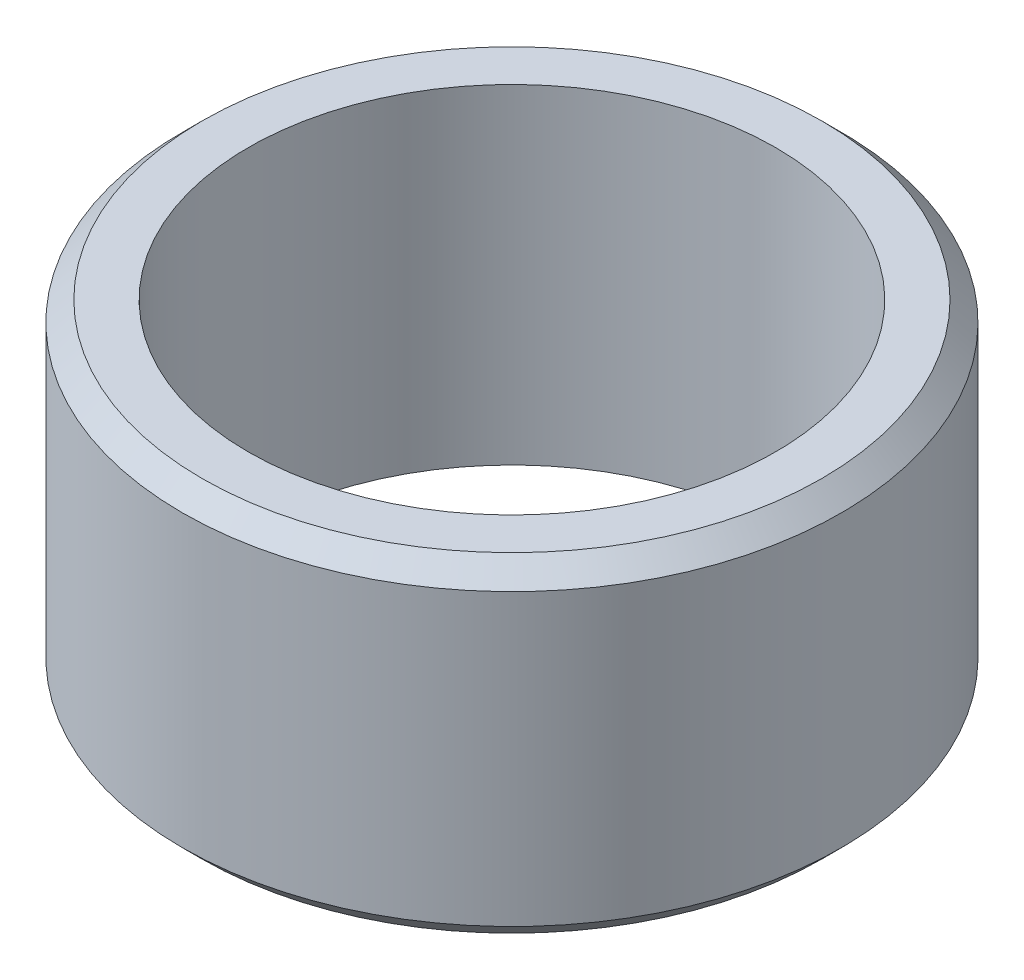
ISO-10303-21;
HEADER;
FILE_DESCRIPTION(('STEP AP214'),'2;1');
FILE_NAME('part.step','',(''),(''),'','','');
FILE_SCHEMA(('AUTOMOTIVE_DESIGN { 1 0 10303 214 1 1 1 1 }'));
ENDSEC;
DATA;
#1=APPLICATION_CONTEXT('core data for automotive mechanical design processes');
#2=APPLICATION_PROTOCOL_DEFINITION('international standard','automotive_design',2000,#1);
#3=PRODUCT_CONTEXT('',#1,'mechanical');
#4=PRODUCT('Part','Part','',(#3));
#5=PRODUCT_RELATED_PRODUCT_CATEGORY('part','',(#4));
#6=PRODUCT_DEFINITION_FORMATION('','',#4);
#7=PRODUCT_DEFINITION_CONTEXT('part definition',#1,'design');
#8=PRODUCT_DEFINITION('design','',#6,#7);
#9=PRODUCT_DEFINITION_SHAPE('','',#8);
#10=(LENGTH_UNIT() NAMED_UNIT(*) SI_UNIT(.MILLI.,.METRE.));
#11=(NAMED_UNIT(*) PLANE_ANGLE_UNIT() SI_UNIT($,.RADIAN.));
#12=(NAMED_UNIT(*) SI_UNIT($,.STERADIAN.) SOLID_ANGLE_UNIT());
#13=UNCERTAINTY_MEASURE_WITH_UNIT(LENGTH_MEASURE(1.E-05),#10,'distance_accuracy_value','');
#14=(GEOMETRIC_REPRESENTATION_CONTEXT(3) GLOBAL_UNCERTAINTY_ASSIGNED_CONTEXT((#13)) GLOBAL_UNIT_ASSIGNED_CONTEXT((#10,
#11,#12)) REPRESENTATION_CONTEXT('',''));
#15=CARTESIAN_POINT('',(0.,0.,0.));
#16=DIRECTION('',(0.,0.,1.));
#17=DIRECTION('',(1.,0.,0.));
#18=AXIS2_PLACEMENT_3D('',#15,#16,#17);
#19=CARTESIAN_POINT('',(0.,5.,0.));
#20=DIRECTION('',(0.,1.,0.));
#21=DIRECTION('',(0.,0.,1.));
#22=AXIS2_PLACEMENT_3D('',#19,#20,#21);
#23=PLANE('',#22);
#24=CARTESIAN_POINT('',(0.,5.,0.));
#25=DIRECTION('',(0.,1.,0.));
#26=DIRECTION('',(0.,0.,1.));
#27=AXIS2_PLACEMENT_3D('',#24,#25,#26);
#28=CIRCLE('',#27,4.7);
#29=CARTESIAN_POINT('',(0.,5.,4.7));
#30=VERTEX_POINT('',#29);
#31=EDGE_CURVE('E10',#30,#30,#28,.T.);
#32=ORIENTED_EDGE('',*,*,#31,.T.);
#33=EDGE_LOOP('',(#32));
#34=FACE_BOUND('',#33,.T.);
#35=CARTESIAN_POINT('',(0.,5.,0.));
#36=DIRECTION('',(0.,1.,0.));
#37=DIRECTION('',(0.,0.,1.));
#38=AXIS2_PLACEMENT_3D('',#35,#36,#37);
#39=CIRCLE('',#38,4.);
#40=CARTESIAN_POINT('',(0.,5.,4.));
#41=VERTEX_POINT('',#40);
#42=EDGE_CURVE('E50',#41,#41,#39,.T.);
#43=ORIENTED_EDGE('',*,*,#42,.F.);
#44=EDGE_LOOP('',(#43));
#45=FACE_BOUND('',#44,.T.);
#46=ADVANCED_FACE('F30',(#34,#45),#23,.T.);
#47=CARTESIAN_POINT('',(0.,0.,0.));
#48=DIRECTION('',(0.,1.,0.));
#49=DIRECTION('',(0.,0.,1.));
#50=AXIS2_PLACEMENT_3D('',#47,#48,#49);
#51=PLANE('',#50);
#52=CARTESIAN_POINT('',(0.,0.,0.));
#53=DIRECTION('',(0.,1.,0.));
#54=DIRECTION('',(0.,0.,1.));
#55=AXIS2_PLACEMENT_3D('',#52,#53,#54);
#56=CIRCLE('',#55,4.7);
#57=CARTESIAN_POINT('',(0.,0.,4.7));
#58=VERTEX_POINT('',#57);
#59=EDGE_CURVE('E37',#58,#58,#56,.F.);
#60=ORIENTED_EDGE('',*,*,#59,.T.);
#61=EDGE_LOOP('',(#60));
#62=FACE_BOUND('',#61,.T.);
#63=CARTESIAN_POINT('',(0.,0.,0.));
#64=DIRECTION('',(0.,1.,0.));
#65=DIRECTION('',(0.,0.,1.));
#66=AXIS2_PLACEMENT_3D('',#63,#64,#65);
#67=CIRCLE('',#66,4.);
#68=CARTESIAN_POINT('',(0.,0.,4.));
#69=VERTEX_POINT('',#68);
#70=EDGE_CURVE('E51',#69,#69,#67,.T.);
#71=ORIENTED_EDGE('',*,*,#70,.T.);
#72=EDGE_LOOP('',(#71));
#73=FACE_BOUND('',#72,.T.);
#74=ADVANCED_FACE('F61',(#62,#73),#51,.F.);
#75=CARTESIAN_POINT('',(0.,5.,0.));
#76=DIRECTION('',(0.,-1.,0.));
#77=DIRECTION('',(0.,0.,-1.));
#78=AXIS2_PLACEMENT_3D('',#75,#76,#77);
#79=CYLINDRICAL_SURFACE('',#78,5.);
#80=CARTESIAN_POINT('',(0.,0.3,0.));
#81=DIRECTION('',(0.,1.,0.));
#82=DIRECTION('',(0.,0.,1.));
#83=AXIS2_PLACEMENT_3D('',#80,#81,#82);
#84=CIRCLE('',#83,5.);
#85=CARTESIAN_POINT('',(0.,0.3,5.));
#86=VERTEX_POINT('',#85);
#87=EDGE_CURVE('E41',#86,#86,#84,.T.);
#88=ORIENTED_EDGE('',*,*,#87,.T.);
#89=EDGE_LOOP('',(#88));
#90=FACE_BOUND('',#89,.T.);
#91=CARTESIAN_POINT('',(0.,4.7,0.));
#92=DIRECTION('',(0.,1.,0.));
#93=DIRECTION('',(0.,0.,1.));
#94=AXIS2_PLACEMENT_3D('',#91,#92,#93);
#95=CIRCLE('',#94,5.);
#96=CARTESIAN_POINT('',(0.,4.7,5.));
#97=VERTEX_POINT('',#96);
#98=EDGE_CURVE('E45',#97,#97,#95,.F.);
#99=ORIENTED_EDGE('',*,*,#98,.T.);
#100=EDGE_LOOP('',(#99));
#101=FACE_BOUND('',#100,.T.);
#102=ADVANCED_FACE('F66',(#90,#101),#79,.T.);
#103=CARTESIAN_POINT('',(0.,5.,0.));
#104=DIRECTION('',(0.,-1.,0.));
#105=DIRECTION('',(0.,0.,-1.));
#106=AXIS2_PLACEMENT_3D('',#103,#104,#105);
#107=CYLINDRICAL_SURFACE('',#106,4.);
#108=ORIENTED_EDGE('',*,*,#42,.T.);
#109=EDGE_LOOP('',(#108));
#110=FACE_BOUND('',#109,.T.);
#111=ORIENTED_EDGE('',*,*,#70,.F.);
#112=EDGE_LOOP('',(#111));
#113=FACE_BOUND('',#112,.T.);
#114=ADVANCED_FACE('F57',(#110,#113),#107,.F.);
#115=CARTESIAN_POINT('',(0.,0.3,0.));
#116=DIRECTION('',(0.,1.,0.));
#117=DIRECTION('',(0.,0.,1.));
#118=AXIS2_PLACEMENT_3D('',#115,#116,#117);
#119=CONICAL_SURFACE('',#118,5.,0.78539816339745);
#120=ORIENTED_EDGE('',*,*,#59,.F.);
#121=EDGE_LOOP('',(#120));
#122=FACE_BOUND('',#121,.T.);
#123=ORIENTED_EDGE('',*,*,#87,.F.);
#124=EDGE_LOOP('',(#123));
#125=FACE_BOUND('',#124,.T.);
#126=ADVANCED_FACE('F72',(#122,#125),#119,.T.);
#127=CARTESIAN_POINT('',(0.,5.,0.));
#128=DIRECTION('',(0.,-1.,0.));
#129=DIRECTION('',(0.,0.,-1.));
#130=AXIS2_PLACEMENT_3D('',#127,#128,#129);
#131=CONICAL_SURFACE('',#130,4.7,0.78539816339745);
#132=ORIENTED_EDGE('',*,*,#98,.F.);
#133=EDGE_LOOP('',(#132));
#134=FACE_BOUND('',#133,.T.);
#135=ORIENTED_EDGE('',*,*,#31,.F.);
#136=EDGE_LOOP('',(#135));
#137=FACE_BOUND('',#136,.T.);
#138=ADVANCED_FACE('F32',(#134,#137),#131,.T.);
#139=CLOSED_SHELL('',(#46,#74,#102,#114,#126,#138));
#140=MANIFOLD_SOLID_BREP('B2',#139);
#141=ADVANCED_BREP_SHAPE_REPRESENTATION('',(#18,#140),#14);
#142=SHAPE_DEFINITION_REPRESENTATION(#9,#141);
ENDSEC;
END-ISO-10303-21;
